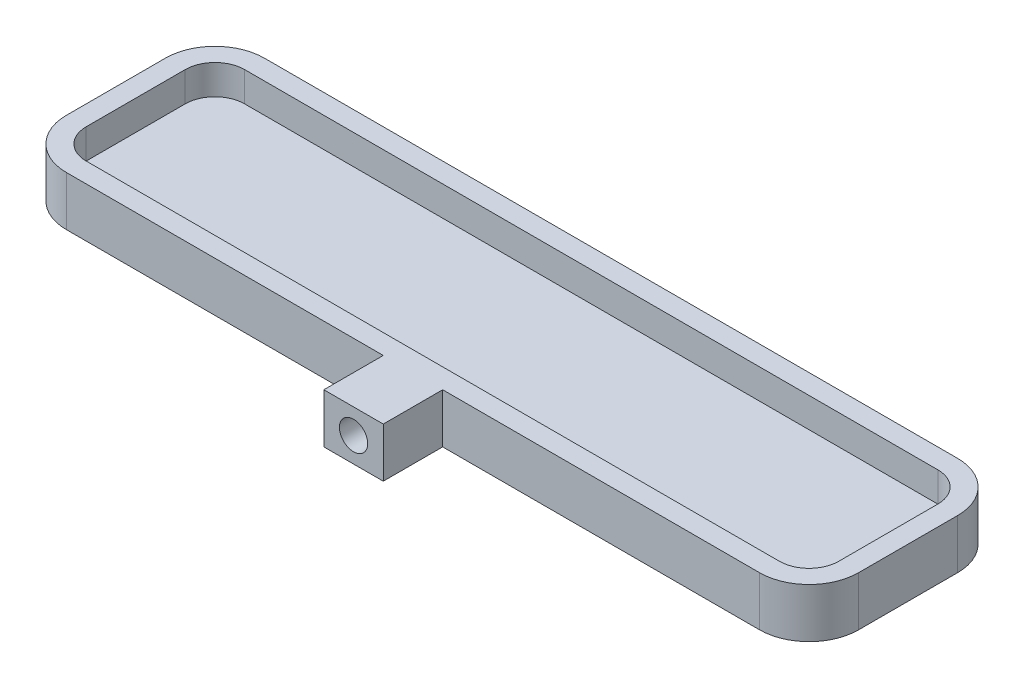
ISO-10303-21;
HEADER;
FILE_DESCRIPTION(('STEP AP214'),'2;1');
FILE_NAME('part.step','',(''),(''),'','','');
FILE_SCHEMA(('AUTOMOTIVE_DESIGN { 1 0 10303 214 1 1 1 1 }'));
ENDSEC;
DATA;
#1=APPLICATION_CONTEXT('core data for automotive mechanical design processes');
#2=APPLICATION_PROTOCOL_DEFINITION('international standard','automotive_design',2000,#1);
#3=PRODUCT_CONTEXT('',#1,'mechanical');
#4=PRODUCT('Part','Part','',(#3));
#5=PRODUCT_RELATED_PRODUCT_CATEGORY('part','',(#4));
#6=PRODUCT_DEFINITION_FORMATION('','',#4);
#7=PRODUCT_DEFINITION_CONTEXT('part definition',#1,'design');
#8=PRODUCT_DEFINITION('design','',#6,#7);
#9=PRODUCT_DEFINITION_SHAPE('','',#8);
#10=(LENGTH_UNIT() NAMED_UNIT(*) SI_UNIT(.MILLI.,.METRE.));
#11=(NAMED_UNIT(*) PLANE_ANGLE_UNIT() SI_UNIT($,.RADIAN.));
#12=(NAMED_UNIT(*) SI_UNIT($,.STERADIAN.) SOLID_ANGLE_UNIT());
#13=UNCERTAINTY_MEASURE_WITH_UNIT(LENGTH_MEASURE(1.E-05),#10,'distance_accuracy_value','');
#14=(GEOMETRIC_REPRESENTATION_CONTEXT(3) GLOBAL_UNCERTAINTY_ASSIGNED_CONTEXT((#13)) GLOBAL_UNIT_ASSIGNED_CONTEXT((#10,
#11,#12)) REPRESENTATION_CONTEXT('',''));
#15=CARTESIAN_POINT('',(0.,0.,0.));
#16=DIRECTION('',(0.,0.,1.));
#17=DIRECTION('',(1.,0.,0.));
#18=AXIS2_PLACEMENT_3D('',#15,#16,#17);
#19=CARTESIAN_POINT('',(-40.,5.,10.));
#20=DIRECTION('',(0.,0.,-1.));
#21=DIRECTION('',(-1.,0.,0.));
#22=AXIS2_PLACEMENT_3D('',#19,#20,#21);
#23=PLANE('',#22);
#24=DIRECTION('',(0.,1.,0.));
#25=VECTOR('',#24,1.);
#26=CARTESIAN_POINT('',(3.,0.,10.));
#27=LINE('',#26,#25);
#28=CARTESIAN_POINT('',(3.,0.,10.));
#29=VERTEX_POINT('',#28);
#30=CARTESIAN_POINT('',(3.,5.,10.));
#31=VERTEX_POINT('',#30);
#32=EDGE_CURVE('E387',#29,#31,#27,.T.);
#33=ORIENTED_EDGE('',*,*,#32,.F.);
#34=DIRECTION('',(1.,0.,0.));
#35=VECTOR('',#34,1.);
#36=CARTESIAN_POINT('',(-40.,0.,10.));
#37=LINE('',#36,#35);
#38=CARTESIAN_POINT('',(35.,0.,10.));
#39=VERTEX_POINT('',#38);
#40=EDGE_CURVE('E203',#29,#39,#37,.T.);
#41=ORIENTED_EDGE('',*,*,#40,.T.);
#42=DIRECTION('',(0.,-1.,0.));
#43=VECTOR('',#42,1.);
#44=CARTESIAN_POINT('',(35.,5.,10.));
#45=LINE('',#44,#43);
#46=CARTESIAN_POINT('',(35.,5.,10.));
#47=VERTEX_POINT('',#46);
#48=EDGE_CURVE('E11',#39,#47,#45,.F.);
#49=ORIENTED_EDGE('',*,*,#48,.T.);
#50=DIRECTION('',(1.,0.,0.));
#51=VECTOR('',#50,1.);
#52=CARTESIAN_POINT('',(-40.,5.,10.));
#53=LINE('',#52,#51);
#54=EDGE_CURVE('E54',#31,#47,#53,.T.);
#55=ORIENTED_EDGE('',*,*,#54,.F.);
#56=EDGE_LOOP('',(#33,#41,#49,#55));
#57=FACE_BOUND('',#56,.T.);
#58=ADVANCED_FACE('F39',(#57),#23,.F.);
#59=DIRECTION('',(0.,-1.,0.));
#60=VECTOR('',#59,1.);
#61=CARTESIAN_POINT('',(-3.,0.,10.));
#62=LINE('',#61,#60);
#63=CARTESIAN_POINT('',(-3.,5.,10.));
#64=VERTEX_POINT('',#63);
#65=CARTESIAN_POINT('',(-3.,0.,10.));
#66=VERTEX_POINT('',#65);
#67=EDGE_CURVE('E62',#64,#66,#62,.T.);
#68=ORIENTED_EDGE('',*,*,#67,.F.);
#69=CARTESIAN_POINT('',(-35.,5.,10.));
#70=VERTEX_POINT('',#69);
#71=EDGE_CURVE('E309',#70,#64,#53,.T.);
#72=ORIENTED_EDGE('',*,*,#71,.F.);
#73=DIRECTION('',(0.,-1.,0.));
#74=VECTOR('',#73,1.);
#75=CARTESIAN_POINT('',(-35.,5.,10.));
#76=LINE('',#75,#74);
#77=CARTESIAN_POINT('',(-35.,0.,10.));
#78=VERTEX_POINT('',#77);
#79=EDGE_CURVE('E48',#70,#78,#76,.T.);
#80=ORIENTED_EDGE('',*,*,#79,.T.);
#81=EDGE_CURVE('E301',#78,#66,#37,.T.);
#82=ORIENTED_EDGE('',*,*,#81,.T.);
#83=EDGE_LOOP('',(#68,#72,#80,#82));
#84=FACE_BOUND('',#83,.T.);
#85=ADVANCED_FACE('F373',(#84),#23,.F.);
#86=CARTESIAN_POINT('',(40.,5.,10.));
#87=DIRECTION('',(-1.,0.,0.));
#88=DIRECTION('',(0.,0.,1.));
#89=AXIS2_PLACEMENT_3D('',#86,#87,#88);
#90=PLANE('',#89);
#91=DIRECTION('',(0.,0.,-1.));
#92=VECTOR('',#91,1.);
#93=CARTESIAN_POINT('',(40.,0.,10.));
#94=LINE('',#93,#92);
#95=CARTESIAN_POINT('',(40.,0.,5.));
#96=VERTEX_POINT('',#95);
#97=CARTESIAN_POINT('',(40.,0.,-5.));
#98=VERTEX_POINT('',#97);
#99=EDGE_CURVE('E272',#96,#98,#94,.T.);
#100=ORIENTED_EDGE('',*,*,#99,.T.);
#101=DIRECTION('',(0.,-1.,0.));
#102=VECTOR('',#101,1.);
#103=CARTESIAN_POINT('',(40.,5.,-5.));
#104=LINE('',#103,#102);
#105=CARTESIAN_POINT('',(40.,5.,-5.));
#106=VERTEX_POINT('',#105);
#107=EDGE_CURVE('E367',#98,#106,#104,.F.);
#108=ORIENTED_EDGE('',*,*,#107,.T.);
#109=DIRECTION('',(0.,0.,-1.));
#110=VECTOR('',#109,1.);
#111=CARTESIAN_POINT('',(40.,5.,10.));
#112=LINE('',#111,#110);
#113=CARTESIAN_POINT('',(40.,5.,5.));
#114=VERTEX_POINT('',#113);
#115=EDGE_CURVE('E296',#114,#106,#112,.T.);
#116=ORIENTED_EDGE('',*,*,#115,.F.);
#117=DIRECTION('',(0.,-1.,0.));
#118=VECTOR('',#117,1.);
#119=CARTESIAN_POINT('',(40.,5.,5.));
#120=LINE('',#119,#118);
#121=EDGE_CURVE('E363',#114,#96,#120,.T.);
#122=ORIENTED_EDGE('',*,*,#121,.T.);
#123=EDGE_LOOP('',(#100,#108,#116,#122));
#124=FACE_BOUND('',#123,.T.);
#125=ADVANCED_FACE('F421',(#124),#90,.F.);
#126=CARTESIAN_POINT('',(-40.,5.,-10.));
#127=DIRECTION('',(0.,0.,1.));
#128=DIRECTION('',(1.,0.,0.));
#129=AXIS2_PLACEMENT_3D('',#126,#127,#128);
#130=PLANE('',#129);
#131=DIRECTION('',(-1.,0.,0.));
#132=VECTOR('',#131,1.);
#133=CARTESIAN_POINT('',(-40.,0.,-10.));
#134=LINE('',#133,#132);
#135=CARTESIAN_POINT('',(35.,0.,-10.));
#136=VERTEX_POINT('',#135);
#137=CARTESIAN_POINT('',(-35.,0.,-10.));
#138=VERTEX_POINT('',#137);
#139=EDGE_CURVE('E316',#136,#138,#134,.T.);
#140=ORIENTED_EDGE('',*,*,#139,.T.);
#141=DIRECTION('',(0.,-1.,0.));
#142=VECTOR('',#141,1.);
#143=CARTESIAN_POINT('',(-35.,5.,-10.));
#144=LINE('',#143,#142);
#145=CARTESIAN_POINT('',(-35.,5.,-10.));
#146=VERTEX_POINT('',#145);
#147=EDGE_CURVE('E348',#138,#146,#144,.F.);
#148=ORIENTED_EDGE('',*,*,#147,.T.);
#149=DIRECTION('',(-1.,0.,0.));
#150=VECTOR('',#149,1.);
#151=CARTESIAN_POINT('',(-40.,5.,-10.));
#152=LINE('',#151,#150);
#153=CARTESIAN_POINT('',(35.,5.,-10.));
#154=VERTEX_POINT('',#153);
#155=EDGE_CURVE('E300',#154,#146,#152,.T.);
#156=ORIENTED_EDGE('',*,*,#155,.F.);
#157=DIRECTION('',(0.,-1.,0.));
#158=VECTOR('',#157,1.);
#159=CARTESIAN_POINT('',(35.,5.,-10.));
#160=LINE('',#159,#158);
#161=EDGE_CURVE('E344',#154,#136,#160,.T.);
#162=ORIENTED_EDGE('',*,*,#161,.T.);
#163=EDGE_LOOP('',(#140,#148,#156,#162));
#164=FACE_BOUND('',#163,.T.);
#165=ADVANCED_FACE('F429',(#164),#130,.F.);
#166=CARTESIAN_POINT('',(-40.,5.,10.));
#167=DIRECTION('',(1.,0.,0.));
#168=DIRECTION('',(0.,0.,-1.));
#169=AXIS2_PLACEMENT_3D('',#166,#167,#168);
#170=PLANE('',#169);
#171=DIRECTION('',(0.,0.,1.));
#172=VECTOR('',#171,1.);
#173=CARTESIAN_POINT('',(-40.,5.,10.));
#174=LINE('',#173,#172);
#175=CARTESIAN_POINT('',(-40.,5.,-5.));
#176=VERTEX_POINT('',#175);
#177=CARTESIAN_POINT('',(-40.,5.,5.));
#178=VERTEX_POINT('',#177);
#179=EDGE_CURVE('E305',#176,#178,#174,.T.);
#180=ORIENTED_EDGE('',*,*,#179,.F.);
#181=DIRECTION('',(0.,-1.,0.));
#182=VECTOR('',#181,1.);
#183=CARTESIAN_POINT('',(-40.,5.,-5.));
#184=LINE('',#183,#182);
#185=CARTESIAN_POINT('',(-40.,0.,-5.));
#186=VERTEX_POINT('',#185);
#187=EDGE_CURVE('E328',#176,#186,#184,.T.);
#188=ORIENTED_EDGE('',*,*,#187,.T.);
#189=DIRECTION('',(0.,0.,1.));
#190=VECTOR('',#189,1.);
#191=CARTESIAN_POINT('',(-40.,0.,10.));
#192=LINE('',#191,#190);
#193=CARTESIAN_POINT('',(-40.,0.,5.));
#194=VERTEX_POINT('',#193);
#195=EDGE_CURVE('E320',#186,#194,#192,.T.);
#196=ORIENTED_EDGE('',*,*,#195,.T.);
#197=DIRECTION('',(0.,-1.,0.));
#198=VECTOR('',#197,1.);
#199=CARTESIAN_POINT('',(-40.,5.,5.));
#200=LINE('',#199,#198);
#201=EDGE_CURVE('E312',#194,#178,#200,.F.);
#202=ORIENTED_EDGE('',*,*,#201,.T.);
#203=EDGE_LOOP('',(#180,#188,#196,#202));
#204=FACE_BOUND('',#203,.T.);
#205=ADVANCED_FACE('F425',(#204),#170,.F.);
#206=CARTESIAN_POINT('',(0.,5.,0.));
#207=DIRECTION('',(0.,-1.,0.));
#208=DIRECTION('',(0.,0.,-1.));
#209=AXIS2_PLACEMENT_3D('',#206,#207,#208);
#210=PLANE('',#209);
#211=DIRECTION('',(-1.,0.,0.));
#212=VECTOR('',#211,1.);
#213=CARTESIAN_POINT('',(0.,5.,-8.));
#214=LINE('',#213,#212);
#215=CARTESIAN_POINT('',(35.,5.,-8.));
#216=VERTEX_POINT('',#215);
#217=CARTESIAN_POINT('',(-35.,5.,-8.));
#218=VERTEX_POINT('',#217);
#219=EDGE_CURVE('E275',#216,#218,#214,.T.);
#220=ORIENTED_EDGE('',*,*,#219,.F.);
#221=CARTESIAN_POINT('',(35.,5.,-5.));
#222=DIRECTION('',(0.,-1.,0.));
#223=DIRECTION('',(0.,0.,-1.));
#224=AXIS2_PLACEMENT_3D('',#221,#222,#223);
#225=CIRCLE('',#224,3.);
#226=CARTESIAN_POINT('',(38.,5.,-5.));
#227=VERTEX_POINT('',#226);
#228=EDGE_CURVE('E276',#227,#216,#225,.F.);
#229=ORIENTED_EDGE('',*,*,#228,.F.);
#230=DIRECTION('',(0.,0.,-1.));
#231=VECTOR('',#230,1.);
#232=CARTESIAN_POINT('',(38.,5.,0.));
#233=LINE('',#232,#231);
#234=CARTESIAN_POINT('',(38.,5.,5.));
#235=VERTEX_POINT('',#234);
#236=EDGE_CURVE('E248',#235,#227,#233,.T.);
#237=ORIENTED_EDGE('',*,*,#236,.F.);
#238=CARTESIAN_POINT('',(35.,5.,5.));
#239=DIRECTION('',(0.,-1.,0.));
#240=DIRECTION('',(0.,0.,-1.));
#241=AXIS2_PLACEMENT_3D('',#238,#239,#240);
#242=CIRCLE('',#241,3.);
#243=CARTESIAN_POINT('',(35.,5.,8.));
#244=VERTEX_POINT('',#243);
#245=EDGE_CURVE('E279',#244,#235,#242,.F.);
#246=ORIENTED_EDGE('',*,*,#245,.F.);
#247=DIRECTION('',(1.,0.,0.));
#248=VECTOR('',#247,1.);
#249=CARTESIAN_POINT('',(0.,5.,8.));
#250=LINE('',#249,#248);
#251=CARTESIAN_POINT('',(-35.,5.,8.));
#252=VERTEX_POINT('',#251);
#253=EDGE_CURVE('E265',#252,#244,#250,.T.);
#254=ORIENTED_EDGE('',*,*,#253,.F.);
#255=CARTESIAN_POINT('',(-35.,5.,5.));
#256=DIRECTION('',(0.,-1.,0.));
#257=DIRECTION('',(0.,0.,-1.));
#258=AXIS2_PLACEMENT_3D('',#255,#256,#257);
#259=CIRCLE('',#258,3.);
#260=CARTESIAN_POINT('',(-38.,5.,5.));
#261=VERTEX_POINT('',#260);
#262=EDGE_CURVE('E255',#261,#252,#259,.F.);
#263=ORIENTED_EDGE('',*,*,#262,.F.);
#264=DIRECTION('',(0.,0.,1.));
#265=VECTOR('',#264,1.);
#266=CARTESIAN_POINT('',(-38.,5.,0.));
#267=LINE('',#266,#265);
#268=CARTESIAN_POINT('',(-38.,5.,-5.));
#269=VERTEX_POINT('',#268);
#270=EDGE_CURVE('E283',#269,#261,#267,.T.);
#271=ORIENTED_EDGE('',*,*,#270,.F.);
#272=CARTESIAN_POINT('',(-35.,5.,-5.));
#273=DIRECTION('',(0.,-1.,0.));
#274=DIRECTION('',(0.,0.,-1.));
#275=AXIS2_PLACEMENT_3D('',#272,#273,#274);
#276=CIRCLE('',#275,3.);
#277=EDGE_CURVE('E225',#218,#269,#276,.F.);
#278=ORIENTED_EDGE('',*,*,#277,.F.);
#279=EDGE_LOOP('',(#220,#229,#237,#246,#254,#263,#271,#278));
#280=FACE_BOUND('',#279,.T.);
#281=ORIENTED_EDGE('',*,*,#155,.T.);
#282=CARTESIAN_POINT('',(-35.,5.,-5.));
#283=DIRECTION('',(0.,-1.,0.));
#284=DIRECTION('',(0.,0.,-1.));
#285=AXIS2_PLACEMENT_3D('',#282,#283,#284);
#286=CIRCLE('',#285,5.);
#287=EDGE_CURVE('E360',#146,#176,#286,.F.);
#288=ORIENTED_EDGE('',*,*,#287,.T.);
#289=ORIENTED_EDGE('',*,*,#179,.T.);
#290=CARTESIAN_POINT('',(-35.,5.,5.));
#291=DIRECTION('',(0.,-1.,0.));
#292=DIRECTION('',(0.,0.,-1.));
#293=AXIS2_PLACEMENT_3D('',#290,#291,#292);
#294=CIRCLE('',#293,5.);
#295=EDGE_CURVE('E351',#178,#70,#294,.F.);
#296=ORIENTED_EDGE('',*,*,#295,.T.);
#297=ORIENTED_EDGE('',*,*,#71,.T.);
#298=DIRECTION('',(0.,0.,-1.));
#299=VECTOR('',#298,1.);
#300=CARTESIAN_POINT('',(-3.,5.,16.));
#301=LINE('',#300,#299);
#302=CARTESIAN_POINT('',(-3.,5.,16.));
#303=VERTEX_POINT('',#302);
#304=EDGE_CURVE('E212',#303,#64,#301,.T.);
#305=ORIENTED_EDGE('',*,*,#304,.F.);
#306=DIRECTION('',(-1.,0.,0.));
#307=VECTOR('',#306,1.);
#308=CARTESIAN_POINT('',(-3.,5.,16.));
#309=LINE('',#308,#307);
#310=CARTESIAN_POINT('',(3.,5.,16.));
#311=VERTEX_POINT('',#310);
#312=EDGE_CURVE('E188',#311,#303,#309,.T.);
#313=ORIENTED_EDGE('',*,*,#312,.F.);
#314=DIRECTION('',(0.,0.,-1.));
#315=VECTOR('',#314,1.);
#316=CARTESIAN_POINT('',(3.,5.,16.));
#317=LINE('',#316,#315);
#318=EDGE_CURVE('E184',#311,#31,#317,.T.);
#319=ORIENTED_EDGE('',*,*,#318,.T.);
#320=ORIENTED_EDGE('',*,*,#54,.T.);
#321=CARTESIAN_POINT('',(35.,5.,5.));
#322=DIRECTION('',(0.,-1.,0.));
#323=DIRECTION('',(0.,0.,-1.));
#324=AXIS2_PLACEMENT_3D('',#321,#322,#323);
#325=CIRCLE('',#324,5.);
#326=EDGE_CURVE('E354',#47,#114,#325,.F.);
#327=ORIENTED_EDGE('',*,*,#326,.T.);
#328=ORIENTED_EDGE('',*,*,#115,.T.);
#329=CARTESIAN_POINT('',(35.,5.,-5.));
#330=DIRECTION('',(0.,-1.,0.));
#331=DIRECTION('',(0.,0.,-1.));
#332=AXIS2_PLACEMENT_3D('',#329,#330,#331);
#333=CIRCLE('',#332,5.);
#334=EDGE_CURVE('E357',#106,#154,#333,.F.);
#335=ORIENTED_EDGE('',*,*,#334,.T.);
#336=EDGE_LOOP('',(#281,#288,#289,#296,#297,#305,#313,#319,#320,#327,#328,#335));
#337=FACE_BOUND('',#336,.T.);
#338=ADVANCED_FACE('F428',(#280,#337),#210,.F.);
#339=CARTESIAN_POINT('',(0.,0.,0.));
#340=DIRECTION('',(0.,-1.,0.));
#341=DIRECTION('',(0.,0.,-1.));
#342=AXIS2_PLACEMENT_3D('',#339,#340,#341);
#343=PLANE('',#342);
#344=ORIENTED_EDGE('',*,*,#195,.F.);
#345=CARTESIAN_POINT('',(-35.,0.,-5.));
#346=DIRECTION('',(0.,-1.,0.));
#347=DIRECTION('',(0.,0.,-1.));
#348=AXIS2_PLACEMENT_3D('',#345,#346,#347);
#349=CIRCLE('',#348,5.);
#350=EDGE_CURVE('E341',#186,#138,#349,.T.);
#351=ORIENTED_EDGE('',*,*,#350,.T.);
#352=ORIENTED_EDGE('',*,*,#139,.F.);
#353=CARTESIAN_POINT('',(35.,0.,-5.));
#354=DIRECTION('',(0.,-1.,0.));
#355=DIRECTION('',(0.,0.,-1.));
#356=AXIS2_PLACEMENT_3D('',#353,#354,#355);
#357=CIRCLE('',#356,5.);
#358=EDGE_CURVE('E338',#136,#98,#357,.T.);
#359=ORIENTED_EDGE('',*,*,#358,.T.);
#360=ORIENTED_EDGE('',*,*,#99,.F.);
#361=CARTESIAN_POINT('',(35.,0.,5.));
#362=DIRECTION('',(0.,-1.,0.));
#363=DIRECTION('',(0.,0.,-1.));
#364=AXIS2_PLACEMENT_3D('',#361,#362,#363);
#365=CIRCLE('',#364,5.);
#366=EDGE_CURVE('E335',#96,#39,#365,.T.);
#367=ORIENTED_EDGE('',*,*,#366,.T.);
#368=ORIENTED_EDGE('',*,*,#40,.F.);
#369=DIRECTION('',(0.,0.,-1.));
#370=VECTOR('',#369,1.);
#371=CARTESIAN_POINT('',(3.,0.,16.));
#372=LINE('',#371,#370);
#373=CARTESIAN_POINT('',(3.,0.,16.));
#374=VERTEX_POINT('',#373);
#375=EDGE_CURVE('E182',#374,#29,#372,.T.);
#376=ORIENTED_EDGE('',*,*,#375,.F.);
#377=DIRECTION('',(1.,0.,0.));
#378=VECTOR('',#377,1.);
#379=CARTESIAN_POINT('',(3.,0.,16.));
#380=LINE('',#379,#378);
#381=CARTESIAN_POINT('',(-3.,0.,16.));
#382=VERTEX_POINT('',#381);
#383=EDGE_CURVE('E189',#382,#374,#380,.T.);
#384=ORIENTED_EDGE('',*,*,#383,.F.);
#385=DIRECTION('',(0.,0.,-1.));
#386=VECTOR('',#385,1.);
#387=CARTESIAN_POINT('',(-3.,0.,16.));
#388=LINE('',#387,#386);
#389=EDGE_CURVE('E376',#382,#66,#388,.T.);
#390=ORIENTED_EDGE('',*,*,#389,.T.);
#391=ORIENTED_EDGE('',*,*,#81,.F.);
#392=CARTESIAN_POINT('',(-35.,0.,5.));
#393=DIRECTION('',(0.,-1.,0.));
#394=DIRECTION('',(0.,0.,-1.));
#395=AXIS2_PLACEMENT_3D('',#392,#393,#394);
#396=CIRCLE('',#395,5.);
#397=EDGE_CURVE('E332',#78,#194,#396,.T.);
#398=ORIENTED_EDGE('',*,*,#397,.T.);
#399=EDGE_LOOP('',(#344,#351,#352,#359,#360,#367,#368,#376,#384,#390,#391,#398));
#400=FACE_BOUND('',#399,.T.);
#401=ADVANCED_FACE('F201',(#400),#343,.T.);
#402=CARTESIAN_POINT('',(-35.,5.,-5.));
#403=DIRECTION('',(0.,-1.,0.));
#404=DIRECTION('',(0.,0.,-1.));
#405=AXIS2_PLACEMENT_3D('',#402,#403,#404);
#406=CYLINDRICAL_SURFACE('',#405,5.);
#407=ORIENTED_EDGE('',*,*,#287,.F.);
#408=ORIENTED_EDGE('',*,*,#147,.F.);
#409=ORIENTED_EDGE('',*,*,#350,.F.);
#410=ORIENTED_EDGE('',*,*,#187,.F.);
#411=EDGE_LOOP('',(#407,#408,#409,#410));
#412=FACE_BOUND('',#411,.T.);
#413=ADVANCED_FACE('F437',(#412),#406,.T.);
#414=CARTESIAN_POINT('',(35.,5.,-5.));
#415=DIRECTION('',(0.,-1.,0.));
#416=DIRECTION('',(0.,0.,-1.));
#417=AXIS2_PLACEMENT_3D('',#414,#415,#416);
#418=CYLINDRICAL_SURFACE('',#417,5.);
#419=ORIENTED_EDGE('',*,*,#334,.F.);
#420=ORIENTED_EDGE('',*,*,#107,.F.);
#421=ORIENTED_EDGE('',*,*,#358,.F.);
#422=ORIENTED_EDGE('',*,*,#161,.F.);
#423=EDGE_LOOP('',(#419,#420,#421,#422));
#424=FACE_BOUND('',#423,.T.);
#425=ADVANCED_FACE('F440',(#424),#418,.T.);
#426=CARTESIAN_POINT('',(35.,5.,5.));
#427=DIRECTION('',(0.,-1.,0.));
#428=DIRECTION('',(0.,0.,-1.));
#429=AXIS2_PLACEMENT_3D('',#426,#427,#428);
#430=CYLINDRICAL_SURFACE('',#429,5.);
#431=ORIENTED_EDGE('',*,*,#326,.F.);
#432=ORIENTED_EDGE('',*,*,#48,.F.);
#433=ORIENTED_EDGE('',*,*,#366,.F.);
#434=ORIENTED_EDGE('',*,*,#121,.F.);
#435=EDGE_LOOP('',(#431,#432,#433,#434));
#436=FACE_BOUND('',#435,.T.);
#437=ADVANCED_FACE('F443',(#436),#430,.T.);
#438=CARTESIAN_POINT('',(-35.,5.,5.));
#439=DIRECTION('',(0.,-1.,0.));
#440=DIRECTION('',(0.,0.,-1.));
#441=AXIS2_PLACEMENT_3D('',#438,#439,#440);
#442=CYLINDRICAL_SURFACE('',#441,5.);
#443=ORIENTED_EDGE('',*,*,#295,.F.);
#444=ORIENTED_EDGE('',*,*,#201,.F.);
#445=ORIENTED_EDGE('',*,*,#397,.F.);
#446=ORIENTED_EDGE('',*,*,#79,.F.);
#447=EDGE_LOOP('',(#443,#444,#445,#446));
#448=FACE_BOUND('',#447,.T.);
#449=ADVANCED_FACE('F41',(#448),#442,.T.);
#450=CARTESIAN_POINT('',(38.,5.,10.));
#451=DIRECTION('',(-1.,0.,0.));
#452=DIRECTION('',(0.,0.,1.));
#453=AXIS2_PLACEMENT_3D('',#450,#451,#452);
#454=PLANE('',#453);
#455=DIRECTION('',(0.,0.,-1.));
#456=VECTOR('',#455,1.);
#457=CARTESIAN_POINT('',(38.,2.,0.));
#458=LINE('',#457,#456);
#459=CARTESIAN_POINT('',(38.,2.,5.));
#460=VERTEX_POINT('',#459);
#461=CARTESIAN_POINT('',(38.,2.,-5.));
#462=VERTEX_POINT('',#461);
#463=EDGE_CURVE('E205',#460,#462,#458,.T.);
#464=ORIENTED_EDGE('',*,*,#463,.F.);
#465=DIRECTION('',(0.,1.,0.));
#466=VECTOR('',#465,1.);
#467=CARTESIAN_POINT('',(38.,5.,5.));
#468=LINE('',#467,#466);
#469=EDGE_CURVE('E221',#235,#460,#468,.F.);
#470=ORIENTED_EDGE('',*,*,#469,.F.);
#471=ORIENTED_EDGE('',*,*,#236,.T.);
#472=DIRECTION('',(0.,1.,0.));
#473=VECTOR('',#472,1.);
#474=CARTESIAN_POINT('',(38.,5.,-5.));
#475=LINE('',#474,#473);
#476=EDGE_CURVE('E216',#462,#227,#475,.T.);
#477=ORIENTED_EDGE('',*,*,#476,.F.);
#478=EDGE_LOOP('',(#464,#470,#471,#477));
#479=FACE_BOUND('',#478,.T.);
#480=ADVANCED_FACE('F450',(#479),#454,.T.);
#481=CARTESIAN_POINT('',(-40.,5.,-8.));
#482=DIRECTION('',(0.,0.,1.));
#483=DIRECTION('',(1.,0.,0.));
#484=AXIS2_PLACEMENT_3D('',#481,#482,#483);
#485=PLANE('',#484);
#486=DIRECTION('',(-1.,0.,0.));
#487=VECTOR('',#486,1.);
#488=CARTESIAN_POINT('',(0.,2.,-8.));
#489=LINE('',#488,#487);
#490=CARTESIAN_POINT('',(35.,2.,-8.));
#491=VERTEX_POINT('',#490);
#492=CARTESIAN_POINT('',(-35.,2.,-8.));
#493=VERTEX_POINT('',#492);
#494=EDGE_CURVE('E210',#491,#493,#489,.T.);
#495=ORIENTED_EDGE('',*,*,#494,.F.);
#496=DIRECTION('',(0.,1.,0.));
#497=VECTOR('',#496,1.);
#498=CARTESIAN_POINT('',(35.,5.,-8.));
#499=LINE('',#498,#497);
#500=EDGE_CURVE('E234',#216,#491,#499,.F.);
#501=ORIENTED_EDGE('',*,*,#500,.F.);
#502=ORIENTED_EDGE('',*,*,#219,.T.);
#503=DIRECTION('',(0.,1.,0.));
#504=VECTOR('',#503,1.);
#505=CARTESIAN_POINT('',(-35.,5.,-8.));
#506=LINE('',#505,#504);
#507=EDGE_CURVE('E252',#493,#218,#506,.T.);
#508=ORIENTED_EDGE('',*,*,#507,.F.);
#509=EDGE_LOOP('',(#495,#501,#502,#508));
#510=FACE_BOUND('',#509,.T.);
#511=ADVANCED_FACE('F504',(#510),#485,.T.);
#512=CARTESIAN_POINT('',(-38.,5.,10.));
#513=DIRECTION('',(1.,0.,0.));
#514=DIRECTION('',(0.,0.,-1.));
#515=AXIS2_PLACEMENT_3D('',#512,#513,#514);
#516=PLANE('',#515);
#517=ORIENTED_EDGE('',*,*,#270,.T.);
#518=DIRECTION('',(0.,1.,0.));
#519=VECTOR('',#518,1.);
#520=CARTESIAN_POINT('',(-38.,5.,5.));
#521=LINE('',#520,#519);
#522=CARTESIAN_POINT('',(-38.,2.,5.));
#523=VERTEX_POINT('',#522);
#524=EDGE_CURVE('E262',#523,#261,#521,.T.);
#525=ORIENTED_EDGE('',*,*,#524,.F.);
#526=DIRECTION('',(0.,0.,1.));
#527=VECTOR('',#526,1.);
#528=CARTESIAN_POINT('',(-38.,2.,0.));
#529=LINE('',#528,#527);
#530=CARTESIAN_POINT('',(-38.,2.,-5.));
#531=VERTEX_POINT('',#530);
#532=EDGE_CURVE('E226',#531,#523,#529,.T.);
#533=ORIENTED_EDGE('',*,*,#532,.F.);
#534=DIRECTION('',(0.,1.,0.));
#535=VECTOR('',#534,1.);
#536=CARTESIAN_POINT('',(-38.,5.,-5.));
#537=LINE('',#536,#535);
#538=EDGE_CURVE('E251',#269,#531,#537,.F.);
#539=ORIENTED_EDGE('',*,*,#538,.F.);
#540=EDGE_LOOP('',(#517,#525,#533,#539));
#541=FACE_BOUND('',#540,.T.);
#542=ADVANCED_FACE('F500',(#541),#516,.T.);
#543=CARTESIAN_POINT('',(-40.,5.,8.));
#544=DIRECTION('',(0.,0.,-1.));
#545=DIRECTION('',(-1.,0.,0.));
#546=AXIS2_PLACEMENT_3D('',#543,#544,#545);
#547=PLANE('',#546);
#548=DIRECTION('',(1.,0.,0.));
#549=VECTOR('',#548,1.);
#550=CARTESIAN_POINT('',(0.,2.,8.));
#551=LINE('',#550,#549);
#552=CARTESIAN_POINT('',(-35.,2.,8.));
#553=VERTEX_POINT('',#552);
#554=CARTESIAN_POINT('',(35.,2.,8.));
#555=VERTEX_POINT('',#554);
#556=EDGE_CURVE('E230',#553,#555,#551,.T.);
#557=ORIENTED_EDGE('',*,*,#556,.F.);
#558=DIRECTION('',(0.,1.,0.));
#559=VECTOR('',#558,1.);
#560=CARTESIAN_POINT('',(-35.,5.,8.));
#561=LINE('',#560,#559);
#562=EDGE_CURVE('E220',#252,#553,#561,.F.);
#563=ORIENTED_EDGE('',*,*,#562,.F.);
#564=ORIENTED_EDGE('',*,*,#253,.T.);
#565=DIRECTION('',(0.,1.,0.));
#566=VECTOR('',#565,1.);
#567=CARTESIAN_POINT('',(35.,5.,8.));
#568=LINE('',#567,#566);
#569=EDGE_CURVE('E269',#555,#244,#568,.T.);
#570=ORIENTED_EDGE('',*,*,#569,.F.);
#571=EDGE_LOOP('',(#557,#563,#564,#570));
#572=FACE_BOUND('',#571,.T.);
#573=ADVANCED_FACE('F496',(#572),#547,.T.);
#574=CARTESIAN_POINT('',(0.,2.,0.));
#575=DIRECTION('',(0.,-1.,0.));
#576=DIRECTION('',(0.,0.,-1.));
#577=AXIS2_PLACEMENT_3D('',#574,#575,#576);
#578=PLANE('',#577);
#579=ORIENTED_EDGE('',*,*,#532,.T.);
#580=CARTESIAN_POINT('',(-35.,2.,5.));
#581=DIRECTION('',(0.,-1.,0.));
#582=DIRECTION('',(0.,0.,-1.));
#583=AXIS2_PLACEMENT_3D('',#580,#581,#582);
#584=CIRCLE('',#583,3.);
#585=EDGE_CURVE('E244',#553,#523,#584,.T.);
#586=ORIENTED_EDGE('',*,*,#585,.F.);
#587=ORIENTED_EDGE('',*,*,#556,.T.);
#588=CARTESIAN_POINT('',(35.,2.,5.));
#589=DIRECTION('',(0.,-1.,0.));
#590=DIRECTION('',(0.,0.,-1.));
#591=AXIS2_PLACEMENT_3D('',#588,#589,#590);
#592=CIRCLE('',#591,3.);
#593=EDGE_CURVE('E241',#460,#555,#592,.T.);
#594=ORIENTED_EDGE('',*,*,#593,.F.);
#595=ORIENTED_EDGE('',*,*,#463,.T.);
#596=CARTESIAN_POINT('',(35.,2.,-5.));
#597=DIRECTION('',(0.,-1.,0.));
#598=DIRECTION('',(0.,0.,-1.));
#599=AXIS2_PLACEMENT_3D('',#596,#597,#598);
#600=CIRCLE('',#599,3.);
#601=EDGE_CURVE('E235',#491,#462,#600,.T.);
#602=ORIENTED_EDGE('',*,*,#601,.F.);
#603=ORIENTED_EDGE('',*,*,#494,.T.);
#604=CARTESIAN_POINT('',(-35.,2.,-5.));
#605=DIRECTION('',(0.,-1.,0.));
#606=DIRECTION('',(0.,0.,-1.));
#607=AXIS2_PLACEMENT_3D('',#604,#605,#606);
#608=CIRCLE('',#607,3.);
#609=EDGE_CURVE('E231',#531,#493,#608,.T.);
#610=ORIENTED_EDGE('',*,*,#609,.F.);
#611=EDGE_LOOP('',(#579,#586,#587,#594,#595,#602,#603,#610));
#612=FACE_BOUND('',#611,.T.);
#613=ADVANCED_FACE('F492',(#612),#578,.F.);
#614=CARTESIAN_POINT('',(-35.,5.,-5.));
#615=DIRECTION('',(0.,-1.,0.));
#616=DIRECTION('',(0.,0.,-1.));
#617=AXIS2_PLACEMENT_3D('',#614,#615,#616);
#618=CYLINDRICAL_SURFACE('',#617,3.);
#619=ORIENTED_EDGE('',*,*,#277,.T.);
#620=ORIENTED_EDGE('',*,*,#538,.T.);
#621=ORIENTED_EDGE('',*,*,#609,.T.);
#622=ORIENTED_EDGE('',*,*,#507,.T.);
#623=EDGE_LOOP('',(#619,#620,#621,#622));
#624=FACE_BOUND('',#623,.T.);
#625=ADVANCED_FACE('F488',(#624),#618,.F.);
#626=CARTESIAN_POINT('',(35.,5.,-5.));
#627=DIRECTION('',(0.,-1.,0.));
#628=DIRECTION('',(0.,0.,-1.));
#629=AXIS2_PLACEMENT_3D('',#626,#627,#628);
#630=CYLINDRICAL_SURFACE('',#629,3.);
#631=ORIENTED_EDGE('',*,*,#228,.T.);
#632=ORIENTED_EDGE('',*,*,#500,.T.);
#633=ORIENTED_EDGE('',*,*,#601,.T.);
#634=ORIENTED_EDGE('',*,*,#476,.T.);
#635=EDGE_LOOP('',(#631,#632,#633,#634));
#636=FACE_BOUND('',#635,.T.);
#637=ADVANCED_FACE('F484',(#636),#630,.F.);
#638=CARTESIAN_POINT('',(35.,5.,5.));
#639=DIRECTION('',(0.,-1.,0.));
#640=DIRECTION('',(0.,0.,-1.));
#641=AXIS2_PLACEMENT_3D('',#638,#639,#640);
#642=CYLINDRICAL_SURFACE('',#641,3.);
#643=ORIENTED_EDGE('',*,*,#245,.T.);
#644=ORIENTED_EDGE('',*,*,#469,.T.);
#645=ORIENTED_EDGE('',*,*,#593,.T.);
#646=ORIENTED_EDGE('',*,*,#569,.T.);
#647=EDGE_LOOP('',(#643,#644,#645,#646));
#648=FACE_BOUND('',#647,.T.);
#649=ADVANCED_FACE('F480',(#648),#642,.F.);
#650=CARTESIAN_POINT('',(-35.,5.,5.));
#651=DIRECTION('',(0.,-1.,0.));
#652=DIRECTION('',(0.,0.,-1.));
#653=AXIS2_PLACEMENT_3D('',#650,#651,#652);
#654=CYLINDRICAL_SURFACE('',#653,3.);
#655=ORIENTED_EDGE('',*,*,#262,.T.);
#656=ORIENTED_EDGE('',*,*,#562,.T.);
#657=ORIENTED_EDGE('',*,*,#585,.T.);
#658=ORIENTED_EDGE('',*,*,#524,.T.);
#659=EDGE_LOOP('',(#655,#656,#657,#658));
#660=FACE_BOUND('',#659,.T.);
#661=ADVANCED_FACE('F477',(#660),#654,.F.);
#662=CARTESIAN_POINT('',(3.,0.,16.));
#663=DIRECTION('',(-1.,0.,0.));
#664=DIRECTION('',(0.,-1.,0.));
#665=AXIS2_PLACEMENT_3D('',#662,#663,#664);
#666=PLANE('',#665);
#667=ORIENTED_EDGE('',*,*,#32,.T.);
#668=ORIENTED_EDGE('',*,*,#318,.F.);
#669=DIRECTION('',(0.,1.,0.));
#670=VECTOR('',#669,1.);
#671=CARTESIAN_POINT('',(3.,0.,16.));
#672=LINE('',#671,#670);
#673=EDGE_CURVE('E178',#374,#311,#672,.T.);
#674=ORIENTED_EDGE('',*,*,#673,.F.);
#675=ORIENTED_EDGE('',*,*,#375,.T.);
#676=EDGE_LOOP('',(#667,#668,#674,#675));
#677=FACE_BOUND('',#676,.T.);
#678=ADVANCED_FACE('F180',(#677),#666,.F.);
#679=CARTESIAN_POINT('',(-3.,0.,16.));
#680=DIRECTION('',(1.,0.,0.));
#681=DIRECTION('',(0.,0.,-1.));
#682=AXIS2_PLACEMENT_3D('',#679,#680,#681);
#683=PLANE('',#682);
#684=ORIENTED_EDGE('',*,*,#67,.T.);
#685=ORIENTED_EDGE('',*,*,#389,.F.);
#686=DIRECTION('',(0.,-1.,0.));
#687=VECTOR('',#686,1.);
#688=CARTESIAN_POINT('',(-3.,0.,16.));
#689=LINE('',#688,#687);
#690=EDGE_CURVE('E194',#303,#382,#689,.T.);
#691=ORIENTED_EDGE('',*,*,#690,.F.);
#692=ORIENTED_EDGE('',*,*,#304,.T.);
#693=EDGE_LOOP('',(#684,#685,#691,#692));
#694=FACE_BOUND('',#693,.T.);
#695=ADVANCED_FACE('F410',(#694),#683,.F.);
#696=CARTESIAN_POINT('',(0.,0.,16.));
#697=DIRECTION('',(0.,0.,-1.));
#698=DIRECTION('',(-1.,0.,0.));
#699=AXIS2_PLACEMENT_3D('',#696,#697,#698);
#700=PLANE('',#699);
#701=CARTESIAN_POINT('',(0.,2.5,16.));
#702=DIRECTION('',(0.,0.,1.));
#703=DIRECTION('',(1.,0.,0.));
#704=AXIS2_PLACEMENT_3D('',#701,#702,#703);
#705=CIRCLE('',#704,1.425);
#706=CARTESIAN_POINT('',(1.425,2.5,16.));
#707=VERTEX_POINT('',#706);
#708=EDGE_CURVE('E393',#707,#707,#705,.T.);
#709=ORIENTED_EDGE('',*,*,#708,.F.);
#710=EDGE_LOOP('',(#709));
#711=FACE_BOUND('',#710,.T.);
#712=ORIENTED_EDGE('',*,*,#383,.T.);
#713=ORIENTED_EDGE('',*,*,#673,.T.);
#714=ORIENTED_EDGE('',*,*,#312,.T.);
#715=ORIENTED_EDGE('',*,*,#690,.T.);
#716=EDGE_LOOP('',(#712,#713,#714,#715));
#717=FACE_BOUND('',#716,.T.);
#718=ADVANCED_FACE('F192',(#711,#717),#700,.F.);
#719=CARTESIAN_POINT('',(0.,2.5,12.));
#720=DIRECTION('',(0.,0.,1.));
#721=DIRECTION('',(1.,0.,0.));
#722=AXIS2_PLACEMENT_3D('',#719,#720,#721);
#723=CYLINDRICAL_SURFACE('',#722,1.425);
#724=CARTESIAN_POINT('',(0.,2.5,12.));
#725=DIRECTION('',(0.,0.,1.));
#726=DIRECTION('',(1.,0.,0.));
#727=AXIS2_PLACEMENT_3D('',#724,#725,#726);
#728=CIRCLE('',#727,1.425);
#729=CARTESIAN_POINT('',(1.425,2.5,12.));
#730=VERTEX_POINT('',#729);
#731=EDGE_CURVE('E389',#730,#730,#728,.T.);
#732=ORIENTED_EDGE('',*,*,#731,.F.);
#733=EDGE_LOOP('',(#732));
#734=FACE_BOUND('',#733,.T.);
#735=ORIENTED_EDGE('',*,*,#708,.T.);
#736=EDGE_LOOP('',(#735));
#737=FACE_BOUND('',#736,.T.);
#738=ADVANCED_FACE('F403',(#734,#737),#723,.F.);
#739=CARTESIAN_POINT('',(0.,2.5,12.));
#740=DIRECTION('',(0.,0.,1.));
#741=DIRECTION('',(1.,0.,0.));
#742=AXIS2_PLACEMENT_3D('',#739,#740,#741);
#743=PLANE('',#742);
#744=ORIENTED_EDGE('',*,*,#731,.T.);
#745=EDGE_LOOP('',(#744));
#746=FACE_BOUND('',#745,.T.);
#747=ADVANCED_FACE('F401',(#746),#743,.T.);
#748=CLOSED_SHELL('',(#58,#85,#125,#165,#205,#338,#401,#413,#425,#437,#449,#480,#511,#542,#573,
#613,#625,#637,#649,#661,#678,#695,#718,#738,#747));
#749=MANIFOLD_SOLID_BREP('B2',#748);
#750=ADVANCED_BREP_SHAPE_REPRESENTATION('',(#18,#749),#14);
#751=SHAPE_DEFINITION_REPRESENTATION(#9,#750);
ENDSEC;
END-ISO-10303-21;
